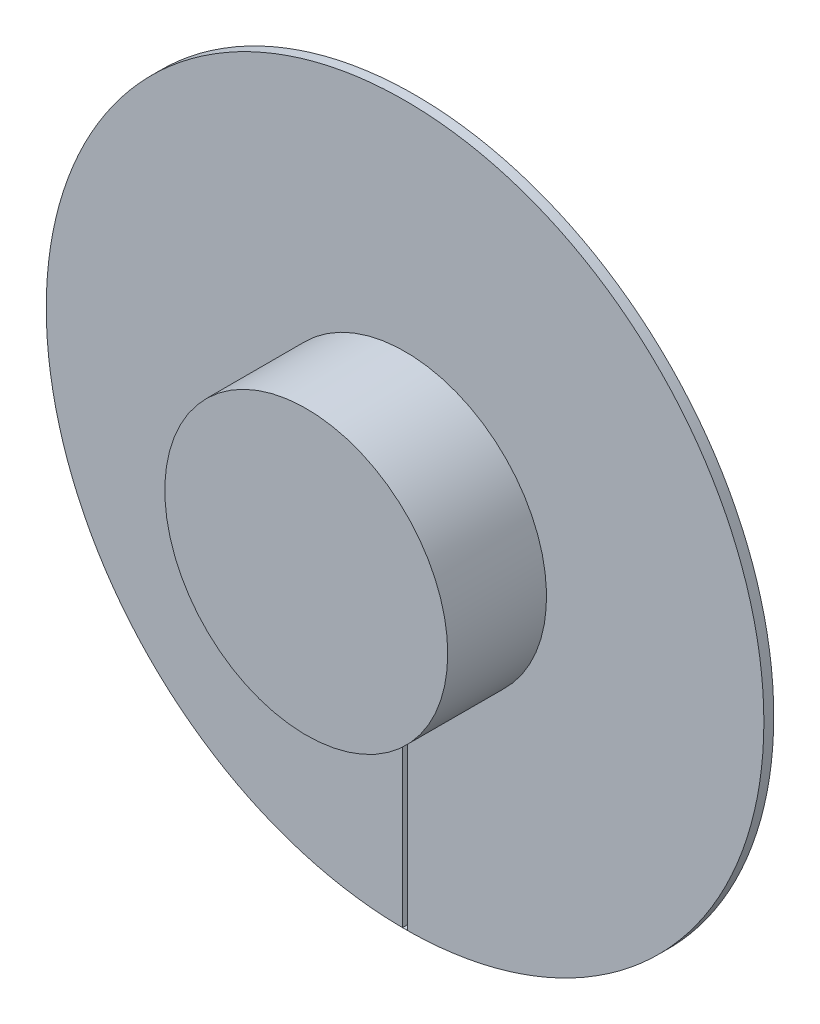
ISO-10303-21;
HEADER;
FILE_DESCRIPTION(('STEP AP214'),'2;1');
FILE_NAME('part.step','',(''),(''),'','','');
FILE_SCHEMA(('AUTOMOTIVE_DESIGN { 1 0 10303 214 1 1 1 1 }'));
ENDSEC;
DATA;
#1=APPLICATION_CONTEXT('core data for automotive mechanical design processes');
#2=APPLICATION_PROTOCOL_DEFINITION('international standard','automotive_design',2000,#1);
#3=PRODUCT_CONTEXT('',#1,'mechanical');
#4=PRODUCT('Part','Part','',(#3));
#5=PRODUCT_RELATED_PRODUCT_CATEGORY('part','',(#4));
#6=PRODUCT_DEFINITION_FORMATION('','',#4);
#7=PRODUCT_DEFINITION_CONTEXT('part definition',#1,'design');
#8=PRODUCT_DEFINITION('design','',#6,#7);
#9=PRODUCT_DEFINITION_SHAPE('','',#8);
#10=(LENGTH_UNIT() NAMED_UNIT(*) SI_UNIT(.MILLI.,.METRE.));
#11=(NAMED_UNIT(*) PLANE_ANGLE_UNIT() SI_UNIT($,.RADIAN.));
#12=(NAMED_UNIT(*) SI_UNIT($,.STERADIAN.) SOLID_ANGLE_UNIT());
#13=UNCERTAINTY_MEASURE_WITH_UNIT(LENGTH_MEASURE(1.E-05),#10,'distance_accuracy_value','');
#14=(GEOMETRIC_REPRESENTATION_CONTEXT(3) GLOBAL_UNCERTAINTY_ASSIGNED_CONTEXT((#13)) GLOBAL_UNIT_ASSIGNED_CONTEXT((#10,
#11,#12)) REPRESENTATION_CONTEXT('',''));
#15=CARTESIAN_POINT('',(0.,0.,0.));
#16=DIRECTION('',(0.,0.,1.));
#17=DIRECTION('',(1.,0.,0.));
#18=AXIS2_PLACEMENT_3D('',#15,#16,#17);
#19=CARTESIAN_POINT('',(0.,0.,10.));
#20=DIRECTION('',(0.,0.,1.));
#21=DIRECTION('',(1.,0.,0.));
#22=AXIS2_PLACEMENT_3D('',#19,#20,#21);
#23=PLANE('',#22);
#24=CARTESIAN_POINT('',(0.,0.,10.));
#25=DIRECTION('',(0.,0.,1.));
#26=DIRECTION('',(1.,0.,0.));
#27=AXIS2_PLACEMENT_3D('',#24,#25,#26);
#28=CIRCLE('',#27,363.2);
#29=CARTESIAN_POINT('',(363.2,0.,10.));
#30=VERTEX_POINT('',#29);
#31=EDGE_CURVE('E148',#30,#30,#28,.T.);
#32=ORIENTED_EDGE('',*,*,#31,.T.);
#33=EDGE_LOOP('',(#32));
#34=FACE_BOUND('',#33,.T.);
#35=DIRECTION('',(1.,0.,0.));
#36=VECTOR('',#35,1.);
#37=CARTESIAN_POINT('',(-2.49999999999999,-363.1,10.));
#38=LINE('',#37,#36);
#39=CARTESIAN_POINT('',(-2.49999999999999,-363.1,10.));
#40=VERTEX_POINT('',#39);
#41=CARTESIAN_POINT('',(2.50000000000001,-363.1,10.));
#42=VERTEX_POINT('',#41);
#43=EDGE_CURVE('E101',#40,#42,#38,.T.);
#44=ORIENTED_EDGE('',*,*,#43,.F.);
#45=DIRECTION('',(0.,1.,0.));
#46=VECTOR('',#45,1.);
#47=CARTESIAN_POINT('',(-2.49999999999999,-363.1,10.));
#48=LINE('',#47,#46);
#49=CARTESIAN_POINT('',(-2.49999999999999,-143.178175711244,9.99999999999999));
#50=VERTEX_POINT('',#49);
#51=EDGE_CURVE('E116',#40,#50,#48,.T.);
#52=ORIENTED_EDGE('',*,*,#51,.T.);
#53=CARTESIAN_POINT('',(0.,0.,10.));
#54=DIRECTION('',(0.,0.,1.));
#55=DIRECTION('',(1.,0.,0.));
#56=AXIS2_PLACEMENT_3D('',#53,#54,#55);
#57=CIRCLE('',#56,143.2);
#58=CARTESIAN_POINT('',(2.50000000000001,-143.178175711244,10.));
#59=VERTEX_POINT('',#58);
#60=EDGE_CURVE('E55',#59,#50,#57,.T.);
#61=ORIENTED_EDGE('',*,*,#60,.F.);
#62=DIRECTION('',(0.,1.,0.));
#63=VECTOR('',#62,1.);
#64=CARTESIAN_POINT('',(2.50000000000001,-363.1,10.));
#65=LINE('',#64,#63);
#66=EDGE_CURVE('E69',#42,#59,#65,.T.);
#67=ORIENTED_EDGE('',*,*,#66,.F.);
#68=EDGE_LOOP('',(#44,#52,#61,#67));
#69=FACE_BOUND('',#68,.T.);
#70=ADVANCED_FACE('F45',(#34,#69),#23,.T.);
#71=CARTESIAN_POINT('',(0.,0.,10.));
#72=DIRECTION('',(0.,0.,-1.));
#73=DIRECTION('',(-1.,0.,0.));
#74=AXIS2_PLACEMENT_3D('',#71,#72,#73);
#75=CYLINDRICAL_SURFACE('',#74,363.2);
#76=ORIENTED_EDGE('',*,*,#31,.F.);
#77=EDGE_LOOP('',(#76));
#78=FACE_BOUND('',#77,.T.);
#79=CARTESIAN_POINT('',(0.,0.,0.));
#80=DIRECTION('',(0.,0.,1.));
#81=DIRECTION('',(1.,0.,0.));
#82=AXIS2_PLACEMENT_3D('',#79,#80,#81);
#83=CIRCLE('',#82,363.2);
#84=CARTESIAN_POINT('',(363.2,0.,0.));
#85=VERTEX_POINT('',#84);
#86=EDGE_CURVE('E49',#85,#85,#83,.T.);
#87=ORIENTED_EDGE('',*,*,#86,.T.);
#88=EDGE_LOOP('',(#87));
#89=FACE_BOUND('',#88,.T.);
#90=ADVANCED_FACE('F47',(#78,#89),#75,.T.);
#91=CARTESIAN_POINT('',(0.,0.,0.));
#92=DIRECTION('',(0.,0.,1.));
#93=DIRECTION('',(1.,0.,0.));
#94=AXIS2_PLACEMENT_3D('',#91,#92,#93);
#95=PLANE('',#94);
#96=DIRECTION('',(0.,1.,0.));
#97=VECTOR('',#96,1.);
#98=CARTESIAN_POINT('',(-2.49999999999999,-363.1,0.));
#99=LINE('',#98,#97);
#100=CARTESIAN_POINT('',(-2.49999999999999,-363.1,0.));
#101=VERTEX_POINT('',#100);
#102=CARTESIAN_POINT('',(-2.49999999999999,-143.1,0.));
#103=VERTEX_POINT('',#102);
#104=EDGE_CURVE('E103',#101,#103,#99,.T.);
#105=ORIENTED_EDGE('',*,*,#104,.F.);
#106=DIRECTION('',(1.,0.,0.));
#107=VECTOR('',#106,1.);
#108=CARTESIAN_POINT('',(-2.49999999999999,-363.1,0.));
#109=LINE('',#108,#107);
#110=CARTESIAN_POINT('',(2.50000000000001,-363.1,0.));
#111=VERTEX_POINT('',#110);
#112=EDGE_CURVE('E98',#101,#111,#109,.T.);
#113=ORIENTED_EDGE('',*,*,#112,.T.);
#114=DIRECTION('',(0.,1.,0.));
#115=VECTOR('',#114,1.);
#116=CARTESIAN_POINT('',(2.50000000000001,-363.1,0.));
#117=LINE('',#116,#115);
#118=CARTESIAN_POINT('',(2.50000000000001,-143.1,0.));
#119=VERTEX_POINT('',#118);
#120=EDGE_CURVE('E106',#111,#119,#117,.T.);
#121=ORIENTED_EDGE('',*,*,#120,.T.);
#122=DIRECTION('',(1.,0.,0.));
#123=VECTOR('',#122,1.);
#124=CARTESIAN_POINT('',(-2.49999999999999,-143.1,0.));
#125=LINE('',#124,#123);
#126=EDGE_CURVE('E111',#103,#119,#125,.T.);
#127=ORIENTED_EDGE('',*,*,#126,.F.);
#128=EDGE_LOOP('',(#105,#113,#121,#127));
#129=FACE_BOUND('',#128,.T.);
#130=ORIENTED_EDGE('',*,*,#86,.F.);
#131=EDGE_LOOP('',(#130));
#132=FACE_BOUND('',#131,.T.);
#133=ADVANCED_FACE('F113',(#129,#132),#95,.F.);
#134=CARTESIAN_POINT('',(0.,0.,110.));
#135=DIRECTION('',(0.,0.,-1.));
#136=DIRECTION('',(-1.,0.,0.));
#137=AXIS2_PLACEMENT_3D('',#134,#135,#136);
#138=CYLINDRICAL_SURFACE('',#137,143.2);
#139=CARTESIAN_POINT('',(0.,0.,110.));
#140=DIRECTION('',(0.,0.,1.));
#141=DIRECTION('',(1.,0.,0.));
#142=AXIS2_PLACEMENT_3D('',#139,#140,#141);
#143=CIRCLE('',#142,143.2);
#144=CARTESIAN_POINT('',(143.2,0.,110.));
#145=VERTEX_POINT('',#144);
#146=EDGE_CURVE('E139',#145,#145,#143,.T.);
#147=ORIENTED_EDGE('',*,*,#146,.F.);
#148=EDGE_LOOP('',(#147));
#149=FACE_BOUND('',#148,.T.);
#150=EDGE_CURVE('E11',#50,#59,#57,.T.);
#151=ORIENTED_EDGE('',*,*,#150,.T.);
#152=ORIENTED_EDGE('',*,*,#60,.T.);
#153=EDGE_LOOP('',(#151,#152));
#154=FACE_BOUND('',#153,.T.);
#155=ADVANCED_FACE('F160',(#149,#154),#138,.T.);
#156=CARTESIAN_POINT('',(0.,0.,110.));
#157=DIRECTION('',(0.,0.,1.));
#158=DIRECTION('',(1.,0.,0.));
#159=AXIS2_PLACEMENT_3D('',#156,#157,#158);
#160=PLANE('',#159);
#161=ORIENTED_EDGE('',*,*,#146,.T.);
#162=EDGE_LOOP('',(#161));
#163=FACE_BOUND('',#162,.T.);
#164=ADVANCED_FACE('F165',(#163),#160,.T.);
#165=CARTESIAN_POINT('',(0.,0.,10.));
#166=DIRECTION('',(0.,0.,1.));
#167=DIRECTION('',(1.,0.,0.));
#168=AXIS2_PLACEMENT_3D('',#165,#166,#167);
#169=PLANE('',#168);
#170=CARTESIAN_POINT('',(-2.49999999999999,-143.1,10.));
#171=VERTEX_POINT('',#170);
#172=EDGE_CURVE('E120',#50,#171,#48,.T.);
#173=ORIENTED_EDGE('',*,*,#172,.T.);
#174=DIRECTION('',(1.,0.,0.));
#175=VECTOR('',#174,1.);
#176=CARTESIAN_POINT('',(-2.49999999999999,-143.1,10.));
#177=LINE('',#176,#175);
#178=CARTESIAN_POINT('',(2.50000000000001,-143.1,10.));
#179=VERTEX_POINT('',#178);
#180=EDGE_CURVE('E132',#171,#179,#177,.T.);
#181=ORIENTED_EDGE('',*,*,#180,.T.);
#182=EDGE_CURVE('E129',#59,#179,#65,.T.);
#183=ORIENTED_EDGE('',*,*,#182,.F.);
#184=ORIENTED_EDGE('',*,*,#150,.F.);
#185=EDGE_LOOP('',(#173,#181,#183,#184));
#186=FACE_BOUND('',#185,.T.);
#187=ADVANCED_FACE('F177',(#186),#169,.F.);
#188=CARTESIAN_POINT('',(-2.49999999999999,-363.1,0.));
#189=DIRECTION('',(0.,-1.,0.));
#190=DIRECTION('',(0.,0.,-1.));
#191=AXIS2_PLACEMENT_3D('',#188,#189,#190);
#192=PLANE('',#191);
#193=ORIENTED_EDGE('',*,*,#43,.T.);
#194=DIRECTION('',(0.,0.,1.));
#195=VECTOR('',#194,1.);
#196=CARTESIAN_POINT('',(2.50000000000001,-363.1,0.));
#197=LINE('',#196,#195);
#198=EDGE_CURVE('E95',#111,#42,#197,.T.);
#199=ORIENTED_EDGE('',*,*,#198,.F.);
#200=ORIENTED_EDGE('',*,*,#112,.F.);
#201=DIRECTION('',(0.,0.,1.));
#202=VECTOR('',#201,1.);
#203=CARTESIAN_POINT('',(-2.49999999999999,-363.1,0.));
#204=LINE('',#203,#202);
#205=EDGE_CURVE('E136',#101,#40,#204,.T.);
#206=ORIENTED_EDGE('',*,*,#205,.T.);
#207=EDGE_LOOP('',(#193,#199,#200,#206));
#208=FACE_BOUND('',#207,.T.);
#209=ADVANCED_FACE('F96',(#208),#192,.F.);
#210=CARTESIAN_POINT('',(-2.49999999999999,-363.1,0.));
#211=DIRECTION('',(1.,0.,0.));
#212=DIRECTION('',(0.,0.,-1.));
#213=AXIS2_PLACEMENT_3D('',#210,#211,#212);
#214=PLANE('',#213);
#215=ORIENTED_EDGE('',*,*,#51,.F.);
#216=ORIENTED_EDGE('',*,*,#205,.F.);
#217=ORIENTED_EDGE('',*,*,#104,.T.);
#218=DIRECTION('',(0.,0.,1.));
#219=VECTOR('',#218,1.);
#220=CARTESIAN_POINT('',(-2.49999999999999,-143.1,0.));
#221=LINE('',#220,#219);
#222=EDGE_CURVE('E140',#103,#171,#221,.T.);
#223=ORIENTED_EDGE('',*,*,#222,.T.);
#224=ORIENTED_EDGE('',*,*,#172,.F.);
#225=EDGE_LOOP('',(#215,#216,#217,#223,#224));
#226=FACE_BOUND('',#225,.T.);
#227=ADVANCED_FACE('F181',(#226),#214,.T.);
#228=CARTESIAN_POINT('',(-2.49999999999999,-143.1,0.));
#229=DIRECTION('',(0.,-1.,0.));
#230=DIRECTION('',(0.,0.,-1.));
#231=AXIS2_PLACEMENT_3D('',#228,#229,#230);
#232=PLANE('',#231);
#233=ORIENTED_EDGE('',*,*,#180,.F.);
#234=ORIENTED_EDGE('',*,*,#222,.F.);
#235=ORIENTED_EDGE('',*,*,#126,.T.);
#236=DIRECTION('',(0.,0.,1.));
#237=VECTOR('',#236,1.);
#238=CARTESIAN_POINT('',(2.50000000000001,-143.1,0.));
#239=LINE('',#238,#237);
#240=EDGE_CURVE('E63',#119,#179,#239,.T.);
#241=ORIENTED_EDGE('',*,*,#240,.T.);
#242=EDGE_LOOP('',(#233,#234,#235,#241));
#243=FACE_BOUND('',#242,.T.);
#244=ADVANCED_FACE('F184',(#243),#232,.T.);
#245=CARTESIAN_POINT('',(2.50000000000001,-363.1,0.));
#246=DIRECTION('',(1.,0.,0.));
#247=DIRECTION('',(0.,0.,-1.));
#248=AXIS2_PLACEMENT_3D('',#245,#246,#247);
#249=PLANE('',#248);
#250=ORIENTED_EDGE('',*,*,#66,.T.);
#251=ORIENTED_EDGE('',*,*,#182,.T.);
#252=ORIENTED_EDGE('',*,*,#240,.F.);
#253=ORIENTED_EDGE('',*,*,#120,.F.);
#254=ORIENTED_EDGE('',*,*,#198,.T.);
#255=EDGE_LOOP('',(#250,#251,#252,#253,#254));
#256=FACE_BOUND('',#255,.T.);
#257=ADVANCED_FACE('F107',(#256),#249,.F.);
#258=CLOSED_SHELL('',(#70,#90,#133,#155,#164,#187,#209,#227,#244,#257));
#259=MANIFOLD_SOLID_BREP('B2',#258);
#260=ADVANCED_BREP_SHAPE_REPRESENTATION('',(#18,#259),#14);
#261=SHAPE_DEFINITION_REPRESENTATION(#9,#260);
ENDSEC;
END-ISO-10303-21;
